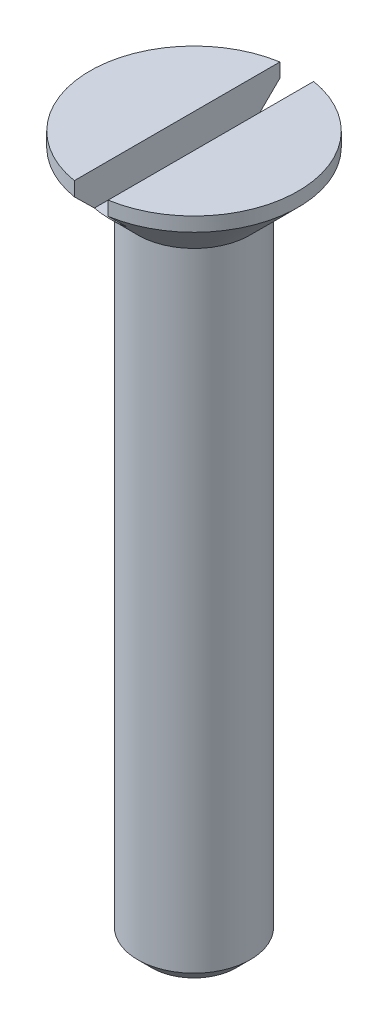
ISO-10303-21;
HEADER;
FILE_DESCRIPTION(('STEP AP214'),'2;1');
FILE_NAME('part.step','',(''),(''),'','','');
FILE_SCHEMA(('AUTOMOTIVE_DESIGN { 1 0 10303 214 1 1 1 1 }'));
ENDSEC;
DATA;
#1=APPLICATION_CONTEXT('core data for automotive mechanical design processes');
#2=APPLICATION_PROTOCOL_DEFINITION('international standard','automotive_design',2000,#1);
#3=PRODUCT_CONTEXT('',#1,'mechanical');
#4=PRODUCT('Part','Part','',(#3));
#5=PRODUCT_RELATED_PRODUCT_CATEGORY('part','',(#4));
#6=PRODUCT_DEFINITION_FORMATION('','',#4);
#7=PRODUCT_DEFINITION_CONTEXT('part definition',#1,'design');
#8=PRODUCT_DEFINITION('design','',#6,#7);
#9=PRODUCT_DEFINITION_SHAPE('','',#8);
#10=(LENGTH_UNIT() NAMED_UNIT(*) SI_UNIT(.MILLI.,.METRE.));
#11=(NAMED_UNIT(*) PLANE_ANGLE_UNIT() SI_UNIT($,.RADIAN.));
#12=(NAMED_UNIT(*) SI_UNIT($,.STERADIAN.) SOLID_ANGLE_UNIT());
#13=UNCERTAINTY_MEASURE_WITH_UNIT(LENGTH_MEASURE(1.E-05),#10,'distance_accuracy_value','');
#14=(GEOMETRIC_REPRESENTATION_CONTEXT(3) GLOBAL_UNCERTAINTY_ASSIGNED_CONTEXT((#13)) GLOBAL_UNIT_ASSIGNED_CONTEXT((#10,
#11,#12)) REPRESENTATION_CONTEXT('',''));
#15=CARTESIAN_POINT('',(0.,0.,0.));
#16=DIRECTION('',(0.,0.,1.));
#17=DIRECTION('',(1.,0.,0.));
#18=AXIS2_PLACEMENT_3D('',#15,#16,#17);
#19=CARTESIAN_POINT('',(-3.7,25.,0.));
#20=DIRECTION('',(0.,1.,0.));
#21=DIRECTION('',(-1.,0.,0.));
#22=AXIS2_PLACEMENT_3D('',#19,#20,#21);
#23=PLANE('',#22);
#24=DIRECTION('',(0.,0.,1.));
#25=VECTOR('',#24,1.);
#26=CARTESIAN_POINT('',(-0.6,25.,-3.7));
#27=LINE('',#26,#25);
#28=CARTESIAN_POINT('',(-0.6,25.,-3.65102725270574));
#29=VERTEX_POINT('',#28);
#30=CARTESIAN_POINT('',(-0.6,25.,3.65102725270574));
#31=VERTEX_POINT('',#30);
#32=EDGE_CURVE('E136',#29,#31,#27,.T.);
#33=ORIENTED_EDGE('',*,*,#32,.F.);
#34=CARTESIAN_POINT('',(0.,25.,0.));
#35=DIRECTION('',(0.,1.,0.));
#36=DIRECTION('',(-1.,0.,0.));
#37=AXIS2_PLACEMENT_3D('',#34,#35,#36);
#38=CIRCLE('',#37,3.7);
#39=EDGE_CURVE('E113',#29,#31,#38,.T.);
#40=ORIENTED_EDGE('',*,*,#39,.T.);
#41=EDGE_LOOP('',(#33,#40));
#42=FACE_BOUND('',#41,.T.);
#43=ADVANCED_FACE('F29',(#42),#23,.T.);
#44=CARTESIAN_POINT('',(0.,25.,0.));
#45=DIRECTION('',(0.,1.,0.));
#46=DIRECTION('',(-1.,0.,0.));
#47=AXIS2_PLACEMENT_3D('',#44,#45,#46);
#48=CYLINDRICAL_SURFACE('',#47,3.7);
#49=DIRECTION('',(0.,1.,0.));
#50=VECTOR('',#49,1.);
#51=CARTESIAN_POINT('',(-0.6,25.,3.65102725270574));
#52=LINE('',#51,#50);
#53=CARTESIAN_POINT('',(-0.6,24.5,3.65102725270574));
#54=VERTEX_POINT('',#53);
#55=EDGE_CURVE('E57',#31,#54,#52,.F.);
#56=ORIENTED_EDGE('',*,*,#55,.F.);
#57=ORIENTED_EDGE('',*,*,#39,.F.);
#58=DIRECTION('',(0.,1.,0.));
#59=VECTOR('',#58,1.);
#60=CARTESIAN_POINT('',(-0.6,25.,-3.65102725270574));
#61=LINE('',#60,#59);
#62=CARTESIAN_POINT('',(-0.6,24.5,-3.65102725270574));
#63=VERTEX_POINT('',#62);
#64=EDGE_CURVE('E130',#63,#29,#61,.T.);
#65=ORIENTED_EDGE('',*,*,#64,.F.);
#66=CARTESIAN_POINT('',(0.,24.5,0.));
#67=DIRECTION('',(0.,1.,0.));
#68=DIRECTION('',(-1.,0.,0.));
#69=AXIS2_PLACEMENT_3D('',#66,#67,#68);
#70=CIRCLE('',#69,3.7);
#71=EDGE_CURVE('E117',#63,#54,#70,.T.);
#72=ORIENTED_EDGE('',*,*,#71,.T.);
#73=EDGE_LOOP('',(#56,#57,#65,#72));
#74=FACE_BOUND('',#73,.T.);
#75=ADVANCED_FACE('F146',(#74),#48,.T.);
#76=DIRECTION('',(0.,0.,1.));
#77=VECTOR('',#76,1.);
#78=CARTESIAN_POINT('',(0.6,25.,-3.7));
#79=LINE('',#78,#77);
#80=CARTESIAN_POINT('',(0.6,25.,-3.65102725270574));
#81=VERTEX_POINT('',#80);
#82=CARTESIAN_POINT('',(0.6,25.,3.65102725270574));
#83=VERTEX_POINT('',#82);
#84=EDGE_CURVE('E100',#81,#83,#79,.T.);
#85=ORIENTED_EDGE('',*,*,#84,.T.);
#86=EDGE_CURVE('E111',#83,#81,#38,.T.);
#87=ORIENTED_EDGE('',*,*,#86,.T.);
#88=EDGE_LOOP('',(#85,#87));
#89=FACE_BOUND('',#88,.T.);
#90=ADVANCED_FACE('F31',(#89),#23,.T.);
#91=DIRECTION('',(0.,1.,0.));
#92=VECTOR('',#91,1.);
#93=CARTESIAN_POINT('',(0.6,25.,-3.65102725270574));
#94=LINE('',#93,#92);
#95=CARTESIAN_POINT('',(0.6,24.5,-3.65102725270574));
#96=VERTEX_POINT('',#95);
#97=EDGE_CURVE('E132',#81,#96,#94,.F.);
#98=ORIENTED_EDGE('',*,*,#97,.F.);
#99=ORIENTED_EDGE('',*,*,#86,.F.);
#100=DIRECTION('',(0.,1.,0.));
#101=VECTOR('',#100,1.);
#102=CARTESIAN_POINT('',(0.6,25.,3.65102725270574));
#103=LINE('',#102,#101);
#104=CARTESIAN_POINT('',(0.6,24.5,3.65102725270574));
#105=VERTEX_POINT('',#104);
#106=EDGE_CURVE('E134',#105,#83,#103,.T.);
#107=ORIENTED_EDGE('',*,*,#106,.F.);
#108=EDGE_CURVE('E106',#105,#96,#70,.T.);
#109=ORIENTED_EDGE('',*,*,#108,.T.);
#110=EDGE_LOOP('',(#98,#99,#107,#109));
#111=FACE_BOUND('',#110,.T.);
#112=ADVANCED_FACE('F153',(#111),#48,.T.);
#113=CARTESIAN_POINT('',(0.,24.5,0.));
#114=DIRECTION('',(0.,1.,0.));
#115=DIRECTION('',(-1.,0.,0.));
#116=AXIS2_PLACEMENT_3D('',#113,#114,#115);
#117=CONICAL_SURFACE('',#116,3.7,0.785398163397443);
#118=CARTESIAN_POINT('',(-0.6,28.9600206241956,8.13793196010485));
#119=CARTESIAN_POINT('',(-0.6,28.6768912812845,7.85402777231896));
#120=CARTESIAN_POINT('',(-0.6,28.3937960861909,7.57008950002176));
#121=CARTESIAN_POINT('',(-0.6,27.8277099701475,7.00209082271698));
#122=CARTESIAN_POINT('',(-0.6,27.5447190528461,6.71803041407336));
#123=CARTESIAN_POINT('',(-0.6,26.9786826072545,6.14953775036887));
#124=CARTESIAN_POINT('',(-0.6,26.6956371983772,5.86510537638401));
#125=CARTESIAN_POINT('',(-0.6,26.1297993439922,5.29600682483286));
#126=CARTESIAN_POINT('',(-0.6,25.8470068908349,5.01134065487301));
#127=CARTESIAN_POINT('',(-0.6,25.2857333258306,4.44556875001048));
#128=CARTESIAN_POINT('',(-0.6,25.0072468080645,4.16446838236597));
#129=CARTESIAN_POINT('',(-0.6,24.590024020769,3.74228982182658));
#130=CARTESIAN_POINT('',(-0.6,24.4510275685893,3.60146883259404));
#131=CARTESIAN_POINT('',(-0.6,24.1732845807478,3.31958319518966));
#132=CARTESIAN_POINT('',(-0.6,24.0345380427178,3.17851854935184));
#133=CARTESIAN_POINT('',(-0.6,23.7574716483417,2.89609946410979));
#134=CARTESIAN_POINT('',(-0.6,23.6191516232573,2.75474519043096));
#135=CARTESIAN_POINT('',(-0.6,23.3430715265049,2.47148070482769));
#136=CARTESIAN_POINT('',(-0.6,23.2053114754901,2.32957047277055));
#137=CARTESIAN_POINT('',(-0.6,22.9307416741205,2.04487556787214));
#138=CARTESIAN_POINT('',(-0.6,22.7939317680324,1.90209104591261));
#139=CARTESIAN_POINT('',(-0.6,22.590052838059,1.68665676476746));
#140=CARTESIAN_POINT('',(-0.6,22.5223178394474,1.61463791010644));
#141=CARTESIAN_POINT('',(-0.6,22.3875043812597,1.4699889932015));
#142=CARTESIAN_POINT('',(-0.6,22.3204259074044,1.39735894431496));
#143=CARTESIAN_POINT('',(-0.6,22.2173706745269,1.28421539613837));
#144=CARTESIAN_POINT('',(-0.6,22.1810405202052,1.24402402952271));
#145=CARTESIAN_POINT('',(-0.6,22.1087770132124,1.16328117926467));
#146=CARTESIAN_POINT('',(-0.6,22.0728436840885,1.12272967450692));
#147=CARTESIAN_POINT('',(-0.6,22.0013920679676,1.04102691374381));
#148=CARTESIAN_POINT('',(-0.6,21.9658755254704,0.999874128580941));
#149=CARTESIAN_POINT('',(-0.6,21.8955848764335,0.916946976871494));
#150=CARTESIAN_POINT('',(-0.6,21.8608106613816,0.875172702709308));
#151=CARTESIAN_POINT('',(-0.6,21.7951073704694,0.794199307952509));
#152=CARTESIAN_POINT('',(-0.6,21.7640957564819,0.75506746605745));
#153=CARTESIAN_POINT('',(-0.6,21.70336797524,0.675813657835012));
#154=CARTESIAN_POINT('',(-0.6,21.6736515728167,0.635691873338652));
#155=CARTESIAN_POINT('',(-0.6,21.6162266564774,0.554135181970054));
#156=CARTESIAN_POINT('',(-0.6,21.5885144284908,0.512702919788471));
#157=CARTESIAN_POINT('',(-0.6,21.5362152220562,0.427935425074674));
#158=CARTESIAN_POINT('',(-0.6,21.5116239202379,0.384602939456324));
#159=CARTESIAN_POINT('',(-0.6,21.4707712434462,0.301726491885907));
#160=CARTESIAN_POINT('',(-0.6,21.45382070719,0.262532602955213));
#161=CARTESIAN_POINT('',(-0.6,21.4259082860384,0.182109312015819));
#162=CARTESIAN_POINT('',(-0.6,21.4149229507895,0.140888585704846));
#163=CARTESIAN_POINT('',(-0.6,21.402410068702,0.0639247858075847));
#164=CARTESIAN_POINT('',(-0.6,21.399623491487,0.0283967599025351));
#165=CARTESIAN_POINT('',(-0.6,21.4004601247095,-0.0425631065150402));
#166=CARTESIAN_POINT('',(-0.6,21.4040811986865,-0.0779949751437744));
#167=CARTESIAN_POINT('',(-0.6,21.4191108613007,-0.159349986954456));
#168=CARTESIAN_POINT('',(-0.6,21.4327039139323,-0.204855293705303));
#169=CARTESIAN_POINT('',(-0.6,21.4581067891676,-0.271162915462722));
#170=CARTESIAN_POINT('',(-0.6,21.4674488375851,-0.29300863845543));
#171=CARTESIAN_POINT('',(-0.6,21.4874539712061,-0.336087239478972));
#172=CARTESIAN_POINT('',(-0.6,21.4981167229907,-0.35732027052515));
#173=CARTESIAN_POINT('',(-0.6,21.5293955558104,-0.415982831640726));
#174=CARTESIAN_POINT('',(-0.6,21.5511562438045,-0.452795694277301));
#175=CARTESIAN_POINT('',(-0.6,21.5968220812861,-0.525077964984167));
#176=CARTESIAN_POINT('',(-0.6,21.6207290147926,-0.560546219893607));
#177=CARTESIAN_POINT('',(-0.6,21.6700419571545,-0.630548437000594));
#178=CARTESIAN_POINT('',(-0.6,21.6954515253791,-0.665079873092579));
#179=CARTESIAN_POINT('',(-0.6,21.7472851044206,-0.733375806005248));
#180=CARTESIAN_POINT('',(-0.6,21.7737092812767,-0.767140175845253));
#181=CARTESIAN_POINT('',(-0.6,21.8543413496578,-0.867919244140555));
#182=CARTESIAN_POINT('',(-0.6,21.9096425797587,-0.934056109051638));
#183=CARTESIAN_POINT('',(-0.6,22.0217665413016,-1.06481071116439));
#184=CARTESIAN_POINT('',(-0.6,22.0785865034983,-1.12943085704483));
#185=CARTESIAN_POINT('',(-0.6,22.1924118710619,-1.25682824366999));
#186=CARTESIAN_POINT('',(-0.6,22.2494025997098,-1.3196186194193));
#187=CARTESIAN_POINT('',(-0.6,22.3640447884687,-1.44459287058116));
#188=CARTESIAN_POINT('',(-0.6,22.421696258976,-1.50677673642221));
#189=CARTESIAN_POINT('',(-0.6,22.5953422390028,-1.69270278432726));
#190=CARTESIAN_POINT('',(-0.6,22.7120179337594,-1.8158079672386));
#191=CARTESIAN_POINT('',(-0.6,22.9464428075932,-2.06118874847631));
#192=CARTESIAN_POINT('',(-0.6,23.0641928200843,-2.18346354647014));
#193=CARTESIAN_POINT('',(-0.6,23.300288903088,-2.42742423040896));
#194=CARTESIAN_POINT('',(-0.6,23.4186349433498,-2.54911014563957));
#195=CARTESIAN_POINT('',(-0.6,23.6550071781252,-2.79137280615513));
#196=CARTESIAN_POINT('',(-0.6,23.7730310413631,-2.91195182898448));
#197=CARTESIAN_POINT('',(-0.6,24.0093478155031,-3.15284893689311));
#198=CARTESIAN_POINT('',(-0.6,24.1276407298918,-3.27316701855089));
#199=CARTESIAN_POINT('',(-0.6,24.4827271369741,-3.63376526150915));
#200=CARTESIAN_POINT('',(-0.6,24.7198037469922,-3.87376652863258));
#201=CARTESIAN_POINT('',(-0.6,25.2886319592404,-4.44861133790128));
#202=CARTESIAN_POINT('',(-0.6,25.6205820339941,-4.78325830289914));
#203=CARTESIAN_POINT('',(-0.6,26.2849478138357,-5.45216769917085));
#204=CARTESIAN_POINT('',(-0.6,26.6173635691107,-5.78643008057167));
#205=CARTESIAN_POINT('',(-0.6,27.2847457930005,-6.45701285565812));
#206=CARTESIAN_POINT('',(-0.6,27.6197140122828,-6.79333150662987));
#207=CARTESIAN_POINT('',(-0.6,28.2897808105559,-7.46575829971181));
#208=CARTESIAN_POINT('',(-0.6,28.6248793690147,-7.80186646228026));
#209=CARTESIAN_POINT('',(-0.6,28.9600206241956,-8.13793196010485));
#210=B_SPLINE_CURVE_WITH_KNOTS('',3,(#118,#119,#120,#121,#122,#123,#124,#125,#126,#127,#128,
#129,#130,#131,#132,#133,#134,#135,#136,#137,#138,#139,#140,#141,#142,#143,#144,#145,#146,#147,
#148,#149,#150,#151,#152,#153,#154,#155,#156,#157,#158,#159,#160,#161,#162,#163,#164,#165,#166,
#167,#168,#169,#170,#171,#172,#173,#174,#175,#176,#177,#178,#179,#180,#181,#182,#183,#184,#185,
#186,#187,#188,#189,#190,#191,#192,#193,#194,#195,#196,#197,#198,#199,#200,#201,#202,#203,#204,
#205,#206,#207,#208,#209),.UNSPECIFIED.,.F.,.F.,(4,2,2,2,2,2,2,2,2,2,2,2,2,2,2,2,2,2,2,2,2,2,2,
2,2,2,2,2,2,2,2,2,2,2,2,2,2,2,2,2,2,2,2,2,2,4),(0.,1.20286091475452,2.40576053584867,
3.6095661884296,4.81333411531857,6.00040930817248,6.59400413473685,7.18759330634945,
7.78090579697012,8.37423997531859,8.96747449255333,9.26407415171825,9.56066734558071,
9.72319861560583,9.88573947880689,10.0488126207255,10.2118617593269,10.3616347814149,
10.5113804952798,10.6608411897885,10.8100925247216,10.9379019301194,11.0652051861339,
11.1715563779878,11.2778721165553,11.4194479223042,11.4907036241509,11.5619413736212,
11.6901080531411,11.8183822726337,11.9469735623141,12.0755859862179,12.3341618029342,
12.5922945826551,12.8466786122313,13.1010666498338,13.6098890890931,14.1191470825746,
14.6283794844875,15.1345611743105,15.6407494616192,16.6528023877669,18.0668791450927,
19.4811222704144,20.9051395740233,22.3289855542461),.UNSPECIFIED.);
#211=CARTESIAN_POINT('',(-0.6,23.8,2.9393876913398));
#212=VERTEX_POINT('',#211);
#213=EDGE_CURVE('E11',#54,#212,#210,.T.);
#214=ORIENTED_EDGE('',*,*,#213,.F.);
#215=ORIENTED_EDGE('',*,*,#71,.F.);
#216=CARTESIAN_POINT('',(-0.6,23.8,-2.9393876913398));
#217=VERTEX_POINT('',#216);
#218=EDGE_CURVE('E33',#217,#63,#210,.T.);
#219=ORIENTED_EDGE('',*,*,#218,.F.);
#220=CARTESIAN_POINT('',(0.,23.8,0.));
#221=DIRECTION('',(0.,-1.,0.));
#222=DIRECTION('',(0.,0.,-1.));
#223=AXIS2_PLACEMENT_3D('',#220,#221,#222);
#224=CIRCLE('',#223,2.99999999999999);
#225=CARTESIAN_POINT('',(0.6,23.8,-2.9393876913398));
#226=VERTEX_POINT('',#225);
#227=EDGE_CURVE('E93',#226,#217,#224,.F.);
#228=ORIENTED_EDGE('',*,*,#227,.F.);
#229=CARTESIAN_POINT('',(0.6,28.9600206241956,-8.13793196010485));
#230=CARTESIAN_POINT('',(0.6,28.6768912812845,-7.85402777231896));
#231=CARTESIAN_POINT('',(0.6,28.3937960861909,-7.57008950002176));
#232=CARTESIAN_POINT('',(0.6,27.8277099701475,-7.00209082271699));
#233=CARTESIAN_POINT('',(0.6,27.5447190528461,-6.71803041407336));
#234=CARTESIAN_POINT('',(0.6,26.9786826072545,-6.14953775036887));
#235=CARTESIAN_POINT('',(0.6,26.6956371983772,-5.86510537638401));
#236=CARTESIAN_POINT('',(0.6,26.1297993439922,-5.29600682483287));
#237=CARTESIAN_POINT('',(0.6,25.8470068908349,-5.01134065487303));
#238=CARTESIAN_POINT('',(0.6,25.2857333258306,-4.44556875001049));
#239=CARTESIAN_POINT('',(0.6,25.0072468080645,-4.16446838236598));
#240=CARTESIAN_POINT('',(0.6,24.590024020769,-3.74228982182658));
#241=CARTESIAN_POINT('',(0.6,24.4510275685893,-3.60146883259404));
#242=CARTESIAN_POINT('',(0.6,24.1732845807478,-3.31958319518966));
#243=CARTESIAN_POINT('',(0.6,24.0345380427178,-3.17851854935185));
#244=CARTESIAN_POINT('',(0.6,23.7574716483417,-2.8960994641098));
#245=CARTESIAN_POINT('',(0.6,23.6191516232573,-2.75474519043097));
#246=CARTESIAN_POINT('',(0.6,23.3430715265049,-2.4714807048277));
#247=CARTESIAN_POINT('',(0.6,23.2053114754901,-2.32957047277056));
#248=CARTESIAN_POINT('',(0.6,22.9307416741205,-2.04487556787214));
#249=CARTESIAN_POINT('',(0.6,22.7939317680324,-1.90209104591261));
#250=CARTESIAN_POINT('',(0.6,22.590052838059,-1.68665676476746));
#251=CARTESIAN_POINT('',(0.6,22.5223178394474,-1.61463791010644));
#252=CARTESIAN_POINT('',(0.6,22.3875043812597,-1.4699889932015));
#253=CARTESIAN_POINT('',(0.6,22.3204259074044,-1.39735894431496));
#254=CARTESIAN_POINT('',(0.6,22.2173706745269,-1.28421539613837));
#255=CARTESIAN_POINT('',(0.6,22.1810405202052,-1.24402402952271));
#256=CARTESIAN_POINT('',(0.6,22.1087770132124,-1.16328117926467));
#257=CARTESIAN_POINT('',(0.6,22.0728436840885,-1.12272967450692));
#258=CARTESIAN_POINT('',(0.6,22.0013920679676,-1.04102691374381));
#259=CARTESIAN_POINT('',(0.6,21.9658755254704,-0.999874128580939));
#260=CARTESIAN_POINT('',(0.6,21.8955848764335,-0.916946976871493));
#261=CARTESIAN_POINT('',(0.6,21.8608106613816,-0.875172702709307));
#262=CARTESIAN_POINT('',(0.6,21.7951073704694,-0.794199307952508));
#263=CARTESIAN_POINT('',(0.6,21.7640957564819,-0.755067466057448));
#264=CARTESIAN_POINT('',(0.6,21.70336797524,-0.675813657835009));
#265=CARTESIAN_POINT('',(0.6,21.6736515728167,-0.635691873338649));
#266=CARTESIAN_POINT('',(0.6,21.6162266564774,-0.554135181970052));
#267=CARTESIAN_POINT('',(0.6,21.5885144284908,-0.512702919788468));
#268=CARTESIAN_POINT('',(0.6,21.5362152220562,-0.427935425074669));
#269=CARTESIAN_POINT('',(0.6,21.5116239202379,-0.384602939456317));
#270=CARTESIAN_POINT('',(0.6,21.4707712434462,-0.301726491885897));
#271=CARTESIAN_POINT('',(0.6,21.45382070719,-0.262532602955204));
#272=CARTESIAN_POINT('',(0.6,21.4259082860384,-0.182109312015809));
#273=CARTESIAN_POINT('',(0.6,21.4149229507895,-0.140888585704835));
#274=CARTESIAN_POINT('',(0.6,21.402410068702,-0.0639247858075736));
#275=CARTESIAN_POINT('',(0.6,21.399623491487,-0.028396759902524));
#276=CARTESIAN_POINT('',(0.6,21.4004601247095,0.0425631065150517));
#277=CARTESIAN_POINT('',(0.6,21.4040811986865,0.0779949751437865));
#278=CARTESIAN_POINT('',(0.6,21.4191108613007,0.15934998695447));
#279=CARTESIAN_POINT('',(0.6,21.4327039139323,0.204855293705319));
#280=CARTESIAN_POINT('',(0.6,21.4581067891676,0.27116291546274));
#281=CARTESIAN_POINT('',(0.6,21.4674488375851,0.293008638455449));
#282=CARTESIAN_POINT('',(0.6,21.4874539712061,0.336087239478992));
#283=CARTESIAN_POINT('',(0.6,21.4981167229907,0.35732027052517));
#284=CARTESIAN_POINT('',(0.6,21.5293955558104,0.415982831640747));
#285=CARTESIAN_POINT('',(0.6,21.5511562438045,0.452795694277325));
#286=CARTESIAN_POINT('',(0.6,21.5968220812861,0.525077964984195));
#287=CARTESIAN_POINT('',(0.6,21.6207290147927,0.560546219893638));
#288=CARTESIAN_POINT('',(0.6,21.6700419571546,0.630548437000629));
#289=CARTESIAN_POINT('',(0.6,21.6954515253791,0.665079873092618));
#290=CARTESIAN_POINT('',(0.6,21.7472851044206,0.733375806005292));
#291=CARTESIAN_POINT('',(0.6,21.7737092812768,0.767140175845301));
#292=CARTESIAN_POINT('',(0.6,21.8543413496579,0.86791924414061));
#293=CARTESIAN_POINT('',(0.6,21.9096425797587,0.934056109051698));
#294=CARTESIAN_POINT('',(0.6,22.0217665413016,1.06481071116446));
#295=CARTESIAN_POINT('',(0.6,22.0785865034983,1.1294308570449));
#296=CARTESIAN_POINT('',(0.6,22.192411871062,1.25682824367008));
#297=CARTESIAN_POINT('',(0.6,22.2494025997099,1.31961861941939));
#298=CARTESIAN_POINT('',(0.6,22.3640447884688,1.44459287058125));
#299=CARTESIAN_POINT('',(0.6,22.4216962589761,1.50677673642232));
#300=CARTESIAN_POINT('',(0.6,22.5953422390029,1.69270278432738));
#301=CARTESIAN_POINT('',(0.6,22.7120179337595,1.81580796723873));
#302=CARTESIAN_POINT('',(0.6,22.9464428075933,2.06118874847646));
#303=CARTESIAN_POINT('',(0.6,23.0641928200844,2.1834635464703));
#304=CARTESIAN_POINT('',(0.6,23.3002889030882,2.42742423040914));
#305=CARTESIAN_POINT('',(0.6,23.41863494335,2.54911014563976));
#306=CARTESIAN_POINT('',(0.6,23.6550071781255,2.79137280615534));
#307=CARTESIAN_POINT('',(0.6,23.7730310413633,2.9119518289847));
#308=CARTESIAN_POINT('',(0.6,24.0093478155033,3.15284893689335));
#309=CARTESIAN_POINT('',(0.6,24.1276407298921,3.27316701855114));
#310=CARTESIAN_POINT('',(0.6,24.4827271369744,3.63376526150943));
#311=CARTESIAN_POINT('',(0.6,24.7198037469925,3.87376652863288));
#312=CARTESIAN_POINT('',(0.6,25.2886319592407,4.44861133790158));
#313=CARTESIAN_POINT('',(0.6,25.6205820339944,4.78325830289941));
#314=CARTESIAN_POINT('',(0.6,26.2849478138359,5.45216769917106));
#315=CARTESIAN_POINT('',(0.6,26.6173635691109,5.78643008057186));
#316=CARTESIAN_POINT('',(0.6,27.2847457930006,6.45701285565825));
#317=CARTESIAN_POINT('',(0.6,27.6197140122829,6.79333150662998));
#318=CARTESIAN_POINT('',(0.6,28.289780810556,7.46575829971186));
#319=CARTESIAN_POINT('',(0.6,28.6248793690147,7.80186646228029));
#320=CARTESIAN_POINT('',(0.6,28.9600206241956,8.13793196010485));
#321=B_SPLINE_CURVE_WITH_KNOTS('',3,(#229,#230,#231,#232,#233,#234,#235,#236,#237,#238,#239,
#240,#241,#242,#243,#244,#245,#246,#247,#248,#249,#250,#251,#252,#253,#254,#255,#256,#257,#258,
#259,#260,#261,#262,#263,#264,#265,#266,#267,#268,#269,#270,#271,#272,#273,#274,#275,#276,#277,
#278,#279,#280,#281,#282,#283,#284,#285,#286,#287,#288,#289,#290,#291,#292,#293,#294,#295,#296,
#297,#298,#299,#300,#301,#302,#303,#304,#305,#306,#307,#308,#309,#310,#311,#312,#313,#314,#315,
#316,#317,#318,#319,#320),.UNSPECIFIED.,.F.,.F.,(4,2,2,2,2,2,2,2,2,2,2,2,2,2,2,2,2,2,2,2,2,2,2,
2,2,2,2,2,2,2,2,2,2,2,2,2,2,2,2,2,2,2,2,2,2,4),(0.,1.20286091475451,2.40576053584866,
3.60956618842958,4.81333411531855,6.00040930817246,6.59400413473684,7.18759330634944,
7.7809057969701,8.37423997531858,8.96747449255332,9.26407415171824,9.5606673455807,
9.72319861560582,9.88573947880689,10.0488126207255,10.2118617593269,10.3616347814149,
10.5113804952798,10.6608411897885,10.8100925247216,10.9379019301194,11.0652051861339,
11.1715563779878,11.2778721165553,11.4194479223042,11.4907036241509,11.5619413736212,
11.6901080531411,11.8183822726337,11.9469735623142,12.075585986218,12.3341618029343,
12.5922945826552,12.8466786122314,13.1010666498339,13.6098890890933,14.1191470825748,
14.6283794844878,15.1345611743108,15.6407494616196,16.6528023877673,18.0668791450931,
19.4811222704146,20.9051395740234,22.3289855542461),.UNSPECIFIED.);
#322=EDGE_CURVE('E98',#96,#226,#321,.T.);
#323=ORIENTED_EDGE('',*,*,#322,.F.);
#324=ORIENTED_EDGE('',*,*,#108,.F.);
#325=CARTESIAN_POINT('',(0.6,23.8,2.9393876913398));
#326=VERTEX_POINT('',#325);
#327=EDGE_CURVE('E43',#326,#105,#321,.T.);
#328=ORIENTED_EDGE('',*,*,#327,.F.);
#329=EDGE_CURVE('E86',#212,#326,#224,.F.);
#330=ORIENTED_EDGE('',*,*,#329,.F.);
#331=EDGE_LOOP('',(#214,#215,#219,#228,#323,#324,#328,#330));
#332=FACE_BOUND('',#331,.T.);
#333=CARTESIAN_POINT('',(0.,22.8,0.));
#334=DIRECTION('',(0.,1.,0.));
#335=DIRECTION('',(-1.,0.,0.));
#336=AXIS2_PLACEMENT_3D('',#333,#334,#335);
#337=CIRCLE('',#336,2.);
#338=CARTESIAN_POINT('',(-2.,22.8,0.));
#339=VERTEX_POINT('',#338);
#340=EDGE_CURVE('E120',#339,#339,#337,.T.);
#341=ORIENTED_EDGE('',*,*,#340,.T.);
#342=EDGE_LOOP('',(#341));
#343=FACE_BOUND('',#342,.T.);
#344=ADVANCED_FACE('F103',(#332,#343),#117,.T.);
#345=CARTESIAN_POINT('',(0.,25.,0.));
#346=DIRECTION('',(0.,1.,0.));
#347=DIRECTION('',(-1.,0.,0.));
#348=AXIS2_PLACEMENT_3D('',#345,#346,#347);
#349=CYLINDRICAL_SURFACE('',#348,2.);
#350=CARTESIAN_POINT('',(0.,0.499999999999997,0.));
#351=DIRECTION('',(0.,1.,0.));
#352=DIRECTION('',(-1.,0.,0.));
#353=AXIS2_PLACEMENT_3D('',#350,#351,#352);
#354=CIRCLE('',#353,2.);
#355=CARTESIAN_POINT('',(-2.,0.499999999999997,0.));
#356=VERTEX_POINT('',#355);
#357=EDGE_CURVE('E123',#356,#356,#354,.T.);
#358=ORIENTED_EDGE('',*,*,#357,.T.);
#359=EDGE_LOOP('',(#358));
#360=FACE_BOUND('',#359,.T.);
#361=ORIENTED_EDGE('',*,*,#340,.F.);
#362=EDGE_LOOP('',(#361));
#363=FACE_BOUND('',#362,.T.);
#364=ADVANCED_FACE('F166',(#360,#363),#349,.T.);
#365=CARTESIAN_POINT('',(0.,0.499999999999997,0.));
#366=DIRECTION('',(0.,1.,0.));
#367=DIRECTION('',(-1.,0.,0.));
#368=AXIS2_PLACEMENT_3D('',#365,#366,#367);
#369=CONICAL_SURFACE('',#368,2.,0.78539816339745);
#370=CARTESIAN_POINT('',(0.,0.,0.));
#371=DIRECTION('',(0.,1.,0.));
#372=DIRECTION('',(-1.,0.,0.));
#373=AXIS2_PLACEMENT_3D('',#370,#371,#372);
#374=CIRCLE('',#373,1.5);
#375=CARTESIAN_POINT('',(-1.5,0.,0.));
#376=VERTEX_POINT('',#375);
#377=EDGE_CURVE('E126',#376,#376,#374,.T.);
#378=ORIENTED_EDGE('',*,*,#377,.T.);
#379=EDGE_LOOP('',(#378));
#380=FACE_BOUND('',#379,.T.);
#381=ORIENTED_EDGE('',*,*,#357,.F.);
#382=EDGE_LOOP('',(#381));
#383=FACE_BOUND('',#382,.T.);
#384=ADVANCED_FACE('F172',(#380,#383),#369,.T.);
#385=CARTESIAN_POINT('',(0.,0.,0.));
#386=DIRECTION('',(0.,-1.,0.));
#387=DIRECTION('',(1.,0.,0.));
#388=AXIS2_PLACEMENT_3D('',#385,#386,#387);
#389=PLANE('',#388);
#390=ORIENTED_EDGE('',*,*,#377,.F.);
#391=EDGE_LOOP('',(#390));
#392=FACE_BOUND('',#391,.T.);
#393=ADVANCED_FACE('F176',(#392),#389,.T.);
#394=CARTESIAN_POINT('',(-0.6,25.,-3.7));
#395=DIRECTION('',(-1.,0.,0.));
#396=DIRECTION('',(0.,-1.,0.));
#397=AXIS2_PLACEMENT_3D('',#394,#395,#396);
#398=PLANE('',#397);
#399=ORIENTED_EDGE('',*,*,#55,.T.);
#400=ORIENTED_EDGE('',*,*,#213,.T.);
#401=DIRECTION('',(0.,0.,1.));
#402=VECTOR('',#401,1.);
#403=CARTESIAN_POINT('',(-0.6,23.8,-3.7));
#404=LINE('',#403,#402);
#405=EDGE_CURVE('E89',#217,#212,#404,.T.);
#406=ORIENTED_EDGE('',*,*,#405,.F.);
#407=ORIENTED_EDGE('',*,*,#218,.T.);
#408=ORIENTED_EDGE('',*,*,#64,.T.);
#409=ORIENTED_EDGE('',*,*,#32,.T.);
#410=EDGE_LOOP('',(#399,#400,#406,#407,#408,#409));
#411=FACE_BOUND('',#410,.T.);
#412=ADVANCED_FACE('F141',(#411),#398,.F.);
#413=CARTESIAN_POINT('',(0.6,25.,-3.7));
#414=DIRECTION('',(1.,0.,0.));
#415=DIRECTION('',(0.,1.,0.));
#416=AXIS2_PLACEMENT_3D('',#413,#414,#415);
#417=PLANE('',#416);
#418=ORIENTED_EDGE('',*,*,#97,.T.);
#419=ORIENTED_EDGE('',*,*,#322,.T.);
#420=DIRECTION('',(0.,0.,1.));
#421=VECTOR('',#420,1.);
#422=CARTESIAN_POINT('',(0.6,23.8,-3.7));
#423=LINE('',#422,#421);
#424=EDGE_CURVE('E50',#226,#326,#423,.T.);
#425=ORIENTED_EDGE('',*,*,#424,.T.);
#426=ORIENTED_EDGE('',*,*,#327,.T.);
#427=ORIENTED_EDGE('',*,*,#106,.T.);
#428=ORIENTED_EDGE('',*,*,#84,.F.);
#429=EDGE_LOOP('',(#418,#419,#425,#426,#427,#428));
#430=FACE_BOUND('',#429,.T.);
#431=ADVANCED_FACE('F95',(#430),#417,.F.);
#432=CARTESIAN_POINT('',(-0.6,23.8,-3.7));
#433=DIRECTION('',(0.,-1.,0.));
#434=DIRECTION('',(0.,0.,-1.));
#435=AXIS2_PLACEMENT_3D('',#432,#433,#434);
#436=PLANE('',#435);
#437=ORIENTED_EDGE('',*,*,#329,.T.);
#438=ORIENTED_EDGE('',*,*,#424,.F.);
#439=ORIENTED_EDGE('',*,*,#227,.T.);
#440=ORIENTED_EDGE('',*,*,#405,.T.);
#441=EDGE_LOOP('',(#437,#438,#439,#440));
#442=FACE_BOUND('',#441,.T.);
#443=ADVANCED_FACE('F87',(#442),#436,.F.);
#444=CLOSED_SHELL('',(#43,#75,#90,#112,#344,#364,#384,#393,#412,#431,#443));
#445=MANIFOLD_SOLID_BREP('B2',#444);
#446=ADVANCED_BREP_SHAPE_REPRESENTATION('',(#18,#445),#14);
#447=SHAPE_DEFINITION_REPRESENTATION(#9,#446);
ENDSEC;
END-ISO-10303-21;
